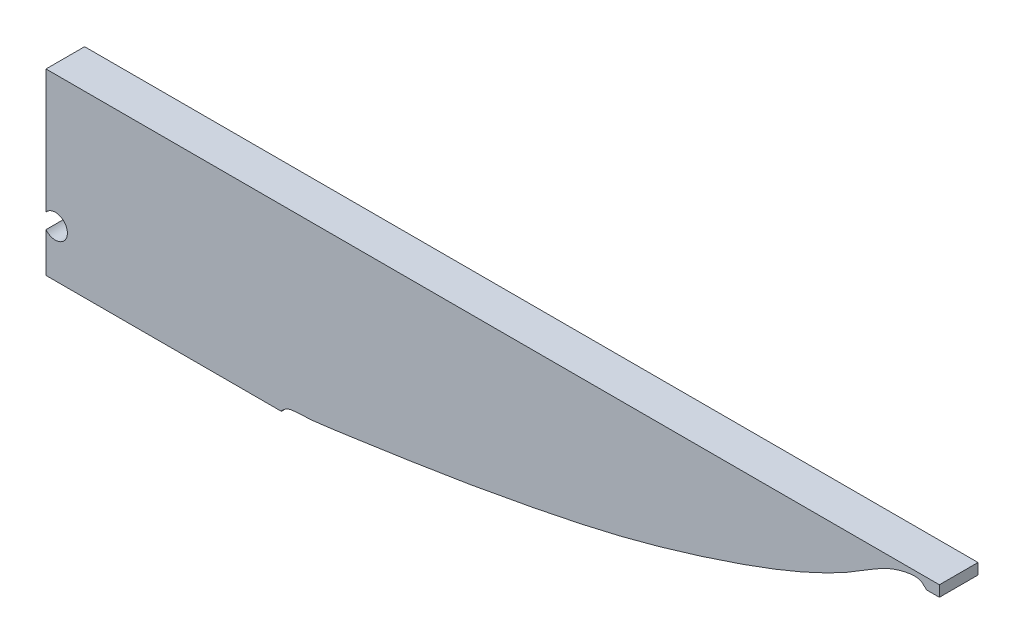
ISO-10303-21;
HEADER;
FILE_DESCRIPTION(('STEP AP214'),'2;1');
FILE_NAME('part.step','',(''),(''),'','','');
FILE_SCHEMA(('AUTOMOTIVE_DESIGN { 1 0 10303 214 1 1 1 1 }'));
ENDSEC;
DATA;
#1=APPLICATION_CONTEXT('core data for automotive mechanical design processes');
#2=APPLICATION_PROTOCOL_DEFINITION('international standard','automotive_design',2000,#1);
#3=PRODUCT_CONTEXT('',#1,'mechanical');
#4=PRODUCT('Part','Part','',(#3));
#5=PRODUCT_RELATED_PRODUCT_CATEGORY('part','',(#4));
#6=PRODUCT_DEFINITION_FORMATION('','',#4);
#7=PRODUCT_DEFINITION_CONTEXT('part definition',#1,'design');
#8=PRODUCT_DEFINITION('design','',#6,#7);
#9=PRODUCT_DEFINITION_SHAPE('','',#8);
#10=(LENGTH_UNIT() NAMED_UNIT(*) SI_UNIT(.MILLI.,.METRE.));
#11=(NAMED_UNIT(*) PLANE_ANGLE_UNIT() SI_UNIT($,.RADIAN.));
#12=(NAMED_UNIT(*) SI_UNIT($,.STERADIAN.) SOLID_ANGLE_UNIT());
#13=UNCERTAINTY_MEASURE_WITH_UNIT(LENGTH_MEASURE(1.E-05),#10,'distance_accuracy_value','');
#14=(GEOMETRIC_REPRESENTATION_CONTEXT(3) GLOBAL_UNCERTAINTY_ASSIGNED_CONTEXT((#13)) GLOBAL_UNIT_ASSIGNED_CONTEXT((#10,
#11,#12)) REPRESENTATION_CONTEXT('',''));
#15=CARTESIAN_POINT('',(0.,0.,0.));
#16=DIRECTION('',(0.,0.,1.));
#17=DIRECTION('',(1.,0.,0.));
#18=AXIS2_PLACEMENT_3D('',#15,#16,#17);
#19=CARTESIAN_POINT('',(-101.938479936782,-34.8132065424627,324.));
#20=DIRECTION('',(1.,0.,0.));
#21=DIRECTION('',(0.,1.,0.));
#22=AXIS2_PLACEMENT_3D('',#19,#20,#21);
#23=PLANE('',#22);
#24=DIRECTION('',(0.,-1.,0.));
#25=VECTOR('',#24,1.);
#26=CARTESIAN_POINT('',(-101.938479936782,-34.8132065424627,316.));
#27=LINE('',#26,#25);
#28=CARTESIAN_POINT('',(-101.938479936782,2.25600000000002,316.));
#29=VERTEX_POINT('',#28);
#30=CARTESIAN_POINT('',(-101.938479936782,-23.4212994157553,316.));
#31=VERTEX_POINT('',#30);
#32=EDGE_CURVE('E249',#29,#31,#27,.T.);
#33=ORIENTED_EDGE('',*,*,#32,.T.);
#34=DIRECTION('',(0.,0.,1.));
#35=VECTOR('',#34,1.);
#36=CARTESIAN_POINT('',(-101.938479936782,-23.4212994157553,308.));
#37=LINE('',#36,#35);
#38=CARTESIAN_POINT('',(-101.938479936782,-23.4212994157553,324.));
#39=VERTEX_POINT('',#38);
#40=EDGE_CURVE('E48',#31,#39,#37,.T.);
#41=ORIENTED_EDGE('',*,*,#40,.T.);
#42=DIRECTION('',(0.,-1.,0.));
#43=VECTOR('',#42,1.);
#44=CARTESIAN_POINT('',(-101.938479936782,-34.8132065424627,324.));
#45=LINE('',#44,#43);
#46=CARTESIAN_POINT('',(-101.938479936782,2.25600000000002,324.));
#47=VERTEX_POINT('',#46);
#48=EDGE_CURVE('E110',#47,#39,#45,.T.);
#49=ORIENTED_EDGE('',*,*,#48,.F.);
#50=DIRECTION('',(0.,0.,-1.));
#51=VECTOR('',#50,1.);
#52=CARTESIAN_POINT('',(-101.938479936782,2.25600000000002,324.));
#53=LINE('',#52,#51);
#54=EDGE_CURVE('E118',#47,#29,#53,.T.);
#55=ORIENTED_EDGE('',*,*,#54,.T.);
#56=EDGE_LOOP('',(#33,#41,#49,#55));
#57=FACE_BOUND('',#56,.T.);
#58=ADVANCED_FACE('F30',(#57),#23,.F.);
#59=CARTESIAN_POINT('',(-53.1549275378333,-34.8091907806009,324.));
#60=CARTESIAN_POINT('',(-53.1298708667686,-34.7201445548623,324.));
#61=CARTESIAN_POINT('',(-53.0789366636254,-34.6422995615166,324.));
#62=CARTESIAN_POINT('',(-52.9577620257177,-34.5051025794421,324.));
#63=CARTESIAN_POINT('',(-52.8899246823672,-34.4440108283981,324.));
#64=CARTESIAN_POINT('',(-52.6828277004742,-34.2644474664142,324.));
#65=CARTESIAN_POINT('',(-52.5430638828932,-34.1462438640899,324.));
#66=CARTESIAN_POINT('',(-52.2472350404539,-33.9350915829857,324.));
#67=CARTESIAN_POINT('',(-52.092019880983,-33.8404166730012,324.));
#68=CARTESIAN_POINT('',(-51.7572426092875,-33.6874209498995,324.));
#69=CARTESIAN_POINT('',(-51.5839717565869,-33.6293652959376,324.));
#70=CARTESIAN_POINT('',(-51.0548344430005,-33.4922042337446,324.));
#71=CARTESIAN_POINT('',(-50.6887400033102,-33.447896332659,324.));
#72=CARTESIAN_POINT('',(-49.9609219867537,-33.38869067422,324.));
#73=CARTESIAN_POINT('',(-49.5959219365605,-33.376606399533,324.));
#74=CARTESIAN_POINT('',(-48.865674265692,-33.3564130200724,324.));
#75=CARTESIAN_POINT('',(-48.5005528247049,-33.3456014629502,324.));
#76=CARTESIAN_POINT('',(-47.771748265183,-33.3072795345679,324.));
#77=CARTESIAN_POINT('',(-47.4078588507021,-33.2822211029365,324.));
#78=CARTESIAN_POINT('',(-46.317616796073,-33.1906459806036,324.));
#79=CARTESIAN_POINT('',(-45.5927094243109,-33.1067704827112,324.));
#80=CARTESIAN_POINT('',(-44.1448865409835,-32.9192556878903,324.));
#81=CARTESIAN_POINT('',(-43.4220109122779,-32.8180340428165,324.));
#82=CARTESIAN_POINT('',(-41.9758965544157,-32.6182073174373,324.));
#83=CARTESIAN_POINT('',(-41.252958421744,-32.5174360867727,324.));
#84=CARTESIAN_POINT('',(-39.0846109921793,-32.2117573392115,324.));
#85=CARTESIAN_POINT('',(-37.6396617723036,-32.0035357794657,324.));
#86=CARTESIAN_POINT('',(-33.3049538379431,-31.3780520832329,324.));
#87=CARTESIAN_POINT('',(-30.4158446665213,-30.9562105112095,324.));
#88=CARTESIAN_POINT('',(-24.6401025014606,-30.0958801875536,324.));
#89=CARTESIAN_POINT('',(-21.7541808939475,-29.6528193090271,324.));
#90=CARTESIAN_POINT('',(-15.9894158874452,-28.7222905479933,324.));
#91=CARTESIAN_POINT('',(-13.1108255517432,-28.2338058152906,324.));
#92=CARTESIAN_POINT('',(-7.36261655694701,-27.209428633291,324.));
#93=CARTESIAN_POINT('',(-4.49259707605948,-26.6748227289964,324.));
#94=CARTESIAN_POINT('',(1.24005807536501,-25.5650908418439,324.));
#95=CARTESIAN_POINT('',(4.10336545393813,-24.9934364793302,324.));
#96=CARTESIAN_POINT('',(9.81588465943968,-23.7886285262029,324.));
#97=CARTESIAN_POINT('',(12.6651295507626,-23.1545048574998,324.));
#98=CARTESIAN_POINT('',(18.34115302415,-21.7846675373089,324.));
#99=CARTESIAN_POINT('',(21.1674651231057,-21.0472729986933,324.));
#100=CARTESIAN_POINT('',(26.7901933578703,-19.4774722148131,324.));
#101=CARTESIAN_POINT('',(29.5880499480561,-18.6459579798337,324.));
#102=CARTESIAN_POINT('',(35.1631796924488,-16.9118970373892,324.));
#103=CARTESIAN_POINT('',(37.9404215095924,-16.0086676868197,324.));
#104=CARTESIAN_POINT('',(43.4646612308998,-14.1163952925042,324.));
#105=CARTESIAN_POINT('',(46.213277565254,-13.1291587617788,324.));
#106=CARTESIAN_POINT('',(50.2968977974003,-11.5480576560877,324.));
#107=CARTESIAN_POINT('',(51.6521252957614,-11.0034212597311,324.));
#108=CARTESIAN_POINT('',(54.3422109967277,-9.87038682235897,324.));
#109=CARTESIAN_POINT('',(55.6759472437144,-9.28172319709407,324.));
#110=CARTESIAN_POINT('',(58.3212740403276,-8.06101885123503,324.));
#111=CARTESIAN_POINT('',(59.6331513600418,-7.42953983132861,324.));
#112=CARTESIAN_POINT('',(62.2276781476394,-6.109332778558,324.));
#113=CARTESIAN_POINT('',(63.5099540056446,-5.41987295066206,324.));
#114=CARTESIAN_POINT('',(65.4000384877134,-4.32040062078005,324.));
#115=CARTESIAN_POINT('',(66.0247194431423,-3.94343619644742,324.));
#116=CARTESIAN_POINT('',(67.2685251327047,-3.17862429736931,324.));
#117=CARTESIAN_POINT('',(67.8867968679098,-2.78905435932817,324.));
#118=CARTESIAN_POINT('',(69.7473260334223,-1.63189882250514,324.));
#119=CARTESIAN_POINT('',(70.9965236676854,-0.878676491304755,324.));
#120=CARTESIAN_POINT('',(72.9770382606335,0.0313865595637071,324.));
#121=CARTESIAN_POINT('',(73.6556666595979,0.296731682483029,324.));
#122=CARTESIAN_POINT('',(75.0507832178697,0.749455274363966,324.));
#123=CARTESIAN_POINT('',(75.7676043796034,0.938695570511541,324.));
#124=CARTESIAN_POINT('',(76.8495518454685,1.14094255861637,324.));
#125=CARTESIAN_POINT('',(77.2122729163409,1.19539414296185,324.));
#126=CARTESIAN_POINT('',(77.7628150940775,1.23664740429515,324.));
#127=CARTESIAN_POINT('',(77.9473635839775,1.24392600760397,324.));
#128=CARTESIAN_POINT('',(78.3189870554186,1.24267483097595,324.));
#129=CARTESIAN_POINT('',(78.504633024259,1.23336108044294,324.));
#130=CARTESIAN_POINT('',(78.8706232698845,1.1834377502822,324.));
#131=CARTESIAN_POINT('',(79.054214120695,1.14135125245161,324.));
#132=CARTESIAN_POINT('',(79.3990381640552,1.00364179747532,324.));
#133=CARTESIAN_POINT('',(79.5554055117071,0.905347272903334,324.));
#134=CARTESIAN_POINT('',(79.8512227913995,0.67771706443728,324.));
#135=CARTESIAN_POINT('',(79.9868284231719,0.550031015610812,324.));
#136=CARTESIAN_POINT('',(80.1960964877878,0.365154334536862,324.));
#137=CARTESIAN_POINT('',(80.2660969464056,0.303800970358101,324.));
#138=CARTESIAN_POINT('',(80.3936641003492,0.167248458555416,324.));
#139=CARTESIAN_POINT('',(80.4481434739488,0.0899135606780191,324.));
#140=CARTESIAN_POINT('',(80.4759889897541,0.,324.));
#141=B_SPLINE_CURVE_WITH_KNOTS('',3,(#59,#60,#61,#62,#63,#64,#65,#66,#67,#68,#69,#70,#71,#72,
#73,#74,#75,#76,#77,#78,#79,#80,#81,#82,#83,#84,#85,#86,#87,#88,#89,#90,#91,#92,#93,#94,#95,#96,
#97,#98,#99,#100,#101,#102,#103,#104,#105,#106,#107,#108,#109,#110,#111,#112,#113,#114,#115,
#116,#117,#118,#119,#120,#121,#122,#123,#124,#125,#126,#127,#128,#129,#130,#131,#132,#133,#134,
#135,#136,#137,#138,#139,#140),.UNSPECIFIED.,.F.,.F.,(4,2,2,2,2,2,2,2,2,2,2,2,2,2,2,2,2,2,2,2,2,
2,2,2,2,2,2,2,2,2,2,2,2,2,2,2,2,2,2,2,4),(0.,0.001953125,0.00390625,0.0078125,
0.0117187499999999,0.0156249999999999,0.0234375,0.03125,0.0390625,0.0468750000000001,
0.0625000000000001,0.0781250000000001,0.0937500000000001,0.125,0.1875,0.25,0.3125,0.375,0.4375,
0.5,0.5625,0.625,0.6875,0.75,0.78125,0.8125,0.84375,0.875,0.890625,0.90625,0.9375,0.953125,
0.96875,0.9765625,0.98046875,0.984375,0.98828125,0.9921875,0.99609375,0.998046875,1.),.UNSPECIFIED.);
#142=DIRECTION('',(0.,0.,-1.));
#143=VECTOR('',#142,1.);
#144=SURFACE_OF_LINEAR_EXTRUSION('',#141,#143);
#145=CARTESIAN_POINT('',(-53.1549275378333,-34.8091907806009,316.));
#146=CARTESIAN_POINT('',(-53.1298708667686,-34.7201445548623,316.));
#147=CARTESIAN_POINT('',(-53.0789366636254,-34.6422995615166,316.));
#148=CARTESIAN_POINT('',(-52.9577620257177,-34.5051025794421,316.));
#149=CARTESIAN_POINT('',(-52.8899246823672,-34.4440108283981,316.));
#150=CARTESIAN_POINT('',(-52.6828277004742,-34.2644474664142,316.));
#151=CARTESIAN_POINT('',(-52.5430638828932,-34.1462438640899,316.));
#152=CARTESIAN_POINT('',(-52.2472350404539,-33.9350915829857,316.));
#153=CARTESIAN_POINT('',(-52.092019880983,-33.8404166730012,316.));
#154=CARTESIAN_POINT('',(-51.7572426092875,-33.6874209498995,316.));
#155=CARTESIAN_POINT('',(-51.5839717565869,-33.6293652959376,316.));
#156=CARTESIAN_POINT('',(-51.0548344430005,-33.4922042337446,316.));
#157=CARTESIAN_POINT('',(-50.6887400033102,-33.447896332659,316.));
#158=CARTESIAN_POINT('',(-49.9609219867537,-33.38869067422,316.));
#159=CARTESIAN_POINT('',(-49.5959219365605,-33.376606399533,316.));
#160=CARTESIAN_POINT('',(-48.865674265692,-33.3564130200724,316.));
#161=CARTESIAN_POINT('',(-48.5005528247049,-33.3456014629502,316.));
#162=CARTESIAN_POINT('',(-47.771748265183,-33.3072795345679,316.));
#163=CARTESIAN_POINT('',(-47.4078588507021,-33.2822211029365,316.));
#164=CARTESIAN_POINT('',(-46.317616796073,-33.1906459806036,316.));
#165=CARTESIAN_POINT('',(-45.5927094243109,-33.1067704827112,316.));
#166=CARTESIAN_POINT('',(-44.1448865409835,-32.9192556878903,316.));
#167=CARTESIAN_POINT('',(-43.4220109122779,-32.8180340428165,316.));
#168=CARTESIAN_POINT('',(-41.9758965544157,-32.6182073174373,316.));
#169=CARTESIAN_POINT('',(-41.252958421744,-32.5174360867727,316.));
#170=CARTESIAN_POINT('',(-39.0846109921793,-32.2117573392115,316.));
#171=CARTESIAN_POINT('',(-37.6396617723036,-32.0035357794657,316.));
#172=CARTESIAN_POINT('',(-33.3049538379431,-31.3780520832329,316.));
#173=CARTESIAN_POINT('',(-30.4158446665213,-30.9562105112095,316.));
#174=CARTESIAN_POINT('',(-24.6401025014606,-30.0958801875536,316.));
#175=CARTESIAN_POINT('',(-21.7541808939475,-29.6528193090271,316.));
#176=CARTESIAN_POINT('',(-15.9894158874452,-28.7222905479933,316.));
#177=CARTESIAN_POINT('',(-13.1108255517432,-28.2338058152906,316.));
#178=CARTESIAN_POINT('',(-7.36261655694701,-27.209428633291,316.));
#179=CARTESIAN_POINT('',(-4.49259707605948,-26.6748227289964,316.));
#180=CARTESIAN_POINT('',(1.24005807536501,-25.5650908418439,316.));
#181=CARTESIAN_POINT('',(4.10336545393813,-24.9934364793302,316.));
#182=CARTESIAN_POINT('',(9.81588465943968,-23.7886285262029,316.));
#183=CARTESIAN_POINT('',(12.6651295507626,-23.1545048574998,316.));
#184=CARTESIAN_POINT('',(18.34115302415,-21.7846675373089,316.));
#185=CARTESIAN_POINT('',(21.1674651231057,-21.0472729986933,316.));
#186=CARTESIAN_POINT('',(26.7901933578703,-19.4774722148131,316.));
#187=CARTESIAN_POINT('',(29.5880499480561,-18.6459579798337,316.));
#188=CARTESIAN_POINT('',(35.1631796924488,-16.9118970373892,316.));
#189=CARTESIAN_POINT('',(37.9404215095924,-16.0086676868197,316.));
#190=CARTESIAN_POINT('',(43.4646612308998,-14.1163952925042,316.));
#191=CARTESIAN_POINT('',(46.213277565254,-13.1291587617788,316.));
#192=CARTESIAN_POINT('',(50.2968977974003,-11.5480576560877,316.));
#193=CARTESIAN_POINT('',(51.6521252957614,-11.0034212597311,316.));
#194=CARTESIAN_POINT('',(54.3422109967277,-9.87038682235897,316.));
#195=CARTESIAN_POINT('',(55.6759472437144,-9.28172319709407,316.));
#196=CARTESIAN_POINT('',(58.3212740403276,-8.06101885123503,316.));
#197=CARTESIAN_POINT('',(59.6331513600418,-7.42953983132861,316.));
#198=CARTESIAN_POINT('',(62.2276781476394,-6.109332778558,316.));
#199=CARTESIAN_POINT('',(63.5099540056446,-5.41987295066206,316.));
#200=CARTESIAN_POINT('',(65.4000384877134,-4.32040062078005,316.));
#201=CARTESIAN_POINT('',(66.0247194431423,-3.94343619644742,316.));
#202=CARTESIAN_POINT('',(67.2685251327047,-3.17862429736931,316.));
#203=CARTESIAN_POINT('',(67.8867968679098,-2.78905435932817,316.));
#204=CARTESIAN_POINT('',(69.7473260334223,-1.63189882250514,316.));
#205=CARTESIAN_POINT('',(70.9965236676854,-0.878676491304755,316.));
#206=CARTESIAN_POINT('',(72.9770382606335,0.0313865595637071,316.));
#207=CARTESIAN_POINT('',(73.6556666595979,0.296731682483029,316.));
#208=CARTESIAN_POINT('',(75.0507832178697,0.749455274363966,316.));
#209=CARTESIAN_POINT('',(75.7676043796034,0.938695570511541,316.));
#210=CARTESIAN_POINT('',(76.8495518454685,1.14094255861637,316.));
#211=CARTESIAN_POINT('',(77.2122729163409,1.19539414296185,316.));
#212=CARTESIAN_POINT('',(77.7628150940775,1.23664740429515,316.));
#213=CARTESIAN_POINT('',(77.9473635839775,1.24392600760397,316.));
#214=CARTESIAN_POINT('',(78.3189870554186,1.24267483097595,316.));
#215=CARTESIAN_POINT('',(78.504633024259,1.23336108044294,316.));
#216=CARTESIAN_POINT('',(78.8706232698845,1.1834377502822,316.));
#217=CARTESIAN_POINT('',(79.054214120695,1.14135125245161,316.));
#218=CARTESIAN_POINT('',(79.3990381640552,1.00364179747532,316.));
#219=CARTESIAN_POINT('',(79.5554055117071,0.905347272903334,316.));
#220=CARTESIAN_POINT('',(79.8512227913995,0.67771706443728,316.));
#221=CARTESIAN_POINT('',(79.9868284231719,0.550031015610812,316.));
#222=CARTESIAN_POINT('',(80.1960964877878,0.365154334536862,316.));
#223=CARTESIAN_POINT('',(80.2660969464056,0.303800970358101,316.));
#224=CARTESIAN_POINT('',(80.3936641003492,0.167248458555416,316.));
#225=CARTESIAN_POINT('',(80.4481434739488,0.0899135606780191,316.));
#226=CARTESIAN_POINT('',(80.4759889897541,0.,316.));
#227=B_SPLINE_CURVE_WITH_KNOTS('',3,(#145,#146,#147,#148,#149,#150,#151,#152,#153,#154,#155,
#156,#157,#158,#159,#160,#161,#162,#163,#164,#165,#166,#167,#168,#169,#170,#171,#172,#173,#174,
#175,#176,#177,#178,#179,#180,#181,#182,#183,#184,#185,#186,#187,#188,#189,#190,#191,#192,#193,
#194,#195,#196,#197,#198,#199,#200,#201,#202,#203,#204,#205,#206,#207,#208,#209,#210,#211,#212,
#213,#214,#215,#216,#217,#218,#219,#220,#221,#222,#223,#224,#225,#226),.UNSPECIFIED.,.F.,.F.,(4,
2,2,2,2,2,2,2,2,2,2,2,2,2,2,2,2,2,2,2,2,2,2,2,2,2,2,2,2,2,2,2,2,2,2,2,2,2,2,2,4),(0.,
0.001953125,0.00390625,0.0078125,0.0117187499999999,0.0156249999999999,0.0234375,0.03125,
0.0390625,0.0468750000000001,0.0625000000000001,0.0781250000000001,0.0937500000000001,0.125,
0.1875,0.25,0.3125,0.375,0.4375,0.5,0.5625,0.625,0.6875,0.75,0.78125,0.8125,0.84375,0.875,
0.890625,0.90625,0.9375,0.953125,0.96875,0.9765625,0.98046875,0.984375,0.98828125,0.9921875,
0.99609375,0.998046875,1.),.UNSPECIFIED.);
#228=CARTESIAN_POINT('',(-53.1549275378332,-34.8091907806009,316.));
#229=VERTEX_POINT('',#228);
#230=CARTESIAN_POINT('',(80.4759889897541,0.,316.));
#231=VERTEX_POINT('',#230);
#232=EDGE_CURVE('E227',#229,#231,#227,.T.);
#233=ORIENTED_EDGE('',*,*,#232,.T.);
#234=DIRECTION('',(0.,0.,-1.));
#235=VECTOR('',#234,1.);
#236=CARTESIAN_POINT('',(80.4759889897541,0.,324.));
#237=LINE('',#236,#235);
#238=CARTESIAN_POINT('',(80.4759889897541,0.,324.));
#239=VERTEX_POINT('',#238);
#240=EDGE_CURVE('E42',#239,#231,#237,.T.);
#241=ORIENTED_EDGE('',*,*,#240,.F.);
#242=CARTESIAN_POINT('',(80.4759889897541,0.,324.));
#243=CARTESIAN_POINT('',(80.4481434739488,0.0899135606780191,324.));
#244=CARTESIAN_POINT('',(80.3936641003492,0.167248458555416,324.));
#245=CARTESIAN_POINT('',(80.2660969464056,0.303800970358101,324.));
#246=CARTESIAN_POINT('',(80.1960964877878,0.365154334536862,324.));
#247=CARTESIAN_POINT('',(79.9868284231719,0.550031015610812,324.));
#248=CARTESIAN_POINT('',(79.8512227913995,0.67771706443728,324.));
#249=CARTESIAN_POINT('',(79.5554055117071,0.905347272903334,324.));
#250=CARTESIAN_POINT('',(79.3990381640552,1.00364179747532,324.));
#251=CARTESIAN_POINT('',(79.054214120695,1.14135125245161,324.));
#252=CARTESIAN_POINT('',(78.8706232698845,1.1834377502822,324.));
#253=CARTESIAN_POINT('',(78.504633024259,1.23336108044294,324.));
#254=CARTESIAN_POINT('',(78.3189870554186,1.24267483097595,324.));
#255=CARTESIAN_POINT('',(77.9473635839775,1.24392600760397,324.));
#256=CARTESIAN_POINT('',(77.7628150940775,1.23664740429515,324.));
#257=CARTESIAN_POINT('',(77.2122729163409,1.19539414296185,324.));
#258=CARTESIAN_POINT('',(76.8495518454685,1.14094255861637,324.));
#259=CARTESIAN_POINT('',(75.7676043796034,0.938695570511541,324.));
#260=CARTESIAN_POINT('',(75.0507832178697,0.749455274363966,324.));
#261=CARTESIAN_POINT('',(73.6556666595979,0.296731682483029,324.));
#262=CARTESIAN_POINT('',(72.9770382606335,0.0313865595637071,324.));
#263=CARTESIAN_POINT('',(70.9965236676854,-0.878676491304755,324.));
#264=CARTESIAN_POINT('',(69.7473260334223,-1.63189882250514,324.));
#265=CARTESIAN_POINT('',(67.8867968679098,-2.78905435932817,324.));
#266=CARTESIAN_POINT('',(67.2685251327047,-3.17862429736931,324.));
#267=CARTESIAN_POINT('',(66.0247194431423,-3.94343619644742,324.));
#268=CARTESIAN_POINT('',(65.4000384877134,-4.32040062078005,324.));
#269=CARTESIAN_POINT('',(63.5099540056446,-5.41987295066206,324.));
#270=CARTESIAN_POINT('',(62.2276781476394,-6.109332778558,324.));
#271=CARTESIAN_POINT('',(59.6331513600418,-7.42953983132861,324.));
#272=CARTESIAN_POINT('',(58.3212740403276,-8.06101885123503,324.));
#273=CARTESIAN_POINT('',(55.6759472437144,-9.28172319709407,324.));
#274=CARTESIAN_POINT('',(54.3422109967277,-9.87038682235897,324.));
#275=CARTESIAN_POINT('',(51.6521252957614,-11.0034212597311,324.));
#276=CARTESIAN_POINT('',(50.2968977974003,-11.5480576560877,324.));
#277=CARTESIAN_POINT('',(46.213277565254,-13.1291587617788,324.));
#278=CARTESIAN_POINT('',(43.4646612308998,-14.1163952925042,324.));
#279=CARTESIAN_POINT('',(37.9404215095924,-16.0086676868197,324.));
#280=CARTESIAN_POINT('',(35.1631796924488,-16.9118970373892,324.));
#281=CARTESIAN_POINT('',(29.5880499480561,-18.6459579798337,324.));
#282=CARTESIAN_POINT('',(26.7901933578703,-19.4774722148131,324.));
#283=CARTESIAN_POINT('',(21.1674651231057,-21.0472729986933,324.));
#284=CARTESIAN_POINT('',(18.34115302415,-21.7846675373089,324.));
#285=CARTESIAN_POINT('',(12.6651295507626,-23.1545048574998,324.));
#286=CARTESIAN_POINT('',(9.81588465943968,-23.7886285262029,324.));
#287=CARTESIAN_POINT('',(4.10336545393813,-24.9934364793302,324.));
#288=CARTESIAN_POINT('',(1.24005807536501,-25.5650908418439,324.));
#289=CARTESIAN_POINT('',(-4.49259707605948,-26.6748227289964,324.));
#290=CARTESIAN_POINT('',(-7.36261655694701,-27.209428633291,324.));
#291=CARTESIAN_POINT('',(-13.1108255517432,-28.2338058152906,324.));
#292=CARTESIAN_POINT('',(-15.9894158874452,-28.7222905479933,324.));
#293=CARTESIAN_POINT('',(-21.7541808939475,-29.6528193090271,324.));
#294=CARTESIAN_POINT('',(-24.6401025014606,-30.0958801875536,324.));
#295=CARTESIAN_POINT('',(-30.4158446665213,-30.9562105112095,324.));
#296=CARTESIAN_POINT('',(-33.3049538379431,-31.3780520832329,324.));
#297=CARTESIAN_POINT('',(-37.6396617723036,-32.0035357794657,324.));
#298=CARTESIAN_POINT('',(-39.0846109921793,-32.2117573392115,324.));
#299=CARTESIAN_POINT('',(-41.252958421744,-32.5174360867727,324.));
#300=CARTESIAN_POINT('',(-41.9758965544157,-32.6182073174373,324.));
#301=CARTESIAN_POINT('',(-43.4220109122779,-32.8180340428165,324.));
#302=CARTESIAN_POINT('',(-44.1448865409835,-32.9192556878903,324.));
#303=CARTESIAN_POINT('',(-45.5927094243109,-33.1067704827112,324.));
#304=CARTESIAN_POINT('',(-46.317616796073,-33.1906459806036,324.));
#305=CARTESIAN_POINT('',(-47.4078588507021,-33.2822211029365,324.));
#306=CARTESIAN_POINT('',(-47.771748265183,-33.3072795345679,324.));
#307=CARTESIAN_POINT('',(-48.5005528247049,-33.3456014629502,324.));
#308=CARTESIAN_POINT('',(-48.865674265692,-33.3564130200724,324.));
#309=CARTESIAN_POINT('',(-49.5959219365605,-33.376606399533,324.));
#310=CARTESIAN_POINT('',(-49.9609219867537,-33.38869067422,324.));
#311=CARTESIAN_POINT('',(-50.6887400033102,-33.447896332659,324.));
#312=CARTESIAN_POINT('',(-51.0548344430005,-33.4922042337446,324.));
#313=CARTESIAN_POINT('',(-51.5839717565869,-33.6293652959376,324.));
#314=CARTESIAN_POINT('',(-51.7572426092875,-33.6874209498995,324.));
#315=CARTESIAN_POINT('',(-52.092019880983,-33.8404166730012,324.));
#316=CARTESIAN_POINT('',(-52.2472350404539,-33.9350915829857,324.));
#317=CARTESIAN_POINT('',(-52.5430638828932,-34.1462438640899,324.));
#318=CARTESIAN_POINT('',(-52.6828277004742,-34.2644474664142,324.));
#319=CARTESIAN_POINT('',(-52.8899246823672,-34.4440108283981,324.));
#320=CARTESIAN_POINT('',(-52.9577620257177,-34.5051025794421,324.));
#321=CARTESIAN_POINT('',(-53.0789366636254,-34.6422995615166,324.));
#322=CARTESIAN_POINT('',(-53.1298708667686,-34.7201445548623,324.));
#323=CARTESIAN_POINT('',(-53.1549275378333,-34.8091907806009,324.));
#324=B_SPLINE_CURVE_WITH_KNOTS('',3,(#242,#243,#244,#245,#246,#247,#248,#249,#250,#251,#252,
#253,#254,#255,#256,#257,#258,#259,#260,#261,#262,#263,#264,#265,#266,#267,#268,#269,#270,#271,
#272,#273,#274,#275,#276,#277,#278,#279,#280,#281,#282,#283,#284,#285,#286,#287,#288,#289,#290,
#291,#292,#293,#294,#295,#296,#297,#298,#299,#300,#301,#302,#303,#304,#305,#306,#307,#308,#309,
#310,#311,#312,#313,#314,#315,#316,#317,#318,#319,#320,#321,#322,#323),.UNSPECIFIED.,.F.,.F.,(4,
2,2,2,2,2,2,2,2,2,2,2,2,2,2,2,2,2,2,2,2,2,2,2,2,2,2,2,2,2,2,2,2,2,2,2,2,2,2,2,4),(0.,
0.001953125,0.00390625,0.0078125,0.0117187499999999,0.0156249999999999,0.0195312499999999,
0.0234374999999998,0.0312499999999998,0.0468749999999997,0.0624999999999996,0.0937499999999996,
0.109375,0.125,0.15625,0.1875,0.21875,0.25,0.3125,0.375,0.4375,0.5,0.5625,0.625,0.6875,0.75,
0.8125,0.875,0.90625,0.921875,0.9375,0.953125,0.9609375,0.96875,0.9765625,0.984375,0.98828125,
0.9921875,0.99609375,0.998046875,1.),.UNSPECIFIED.);
#325=CARTESIAN_POINT('',(-53.1549275378332,-34.8091907806009,324.));
#326=VERTEX_POINT('',#325);
#327=EDGE_CURVE('E209',#326,#239,#324,.F.);
#328=ORIENTED_EDGE('',*,*,#327,.F.);
#329=DIRECTION('',(0.,0.,-1.));
#330=VECTOR('',#329,1.);
#331=CARTESIAN_POINT('',(-53.1549275378332,-34.8091907806009,324.));
#332=LINE('',#331,#330);
#333=EDGE_CURVE('E129',#326,#229,#332,.T.);
#334=ORIENTED_EDGE('',*,*,#333,.T.);
#335=EDGE_LOOP('',(#233,#241,#328,#334));
#336=FACE_BOUND('',#335,.T.);
#337=ADVANCED_FACE('F32',(#336),#144,.F.);
#338=CARTESIAN_POINT('',(80.4759889897541,0.,324.));
#339=DIRECTION('',(0.,1.,0.));
#340=DIRECTION('',(-1.,0.,0.));
#341=AXIS2_PLACEMENT_3D('',#338,#339,#340);
#342=PLANE('',#341);
#343=DIRECTION('',(1.,0.,0.));
#344=VECTOR('',#343,1.);
#345=CARTESIAN_POINT('',(80.4759889897541,0.,316.));
#346=LINE('',#345,#344);
#347=CARTESIAN_POINT('',(83.2228555421549,0.,316.));
#348=VERTEX_POINT('',#347);
#349=EDGE_CURVE('E175',#231,#348,#346,.T.);
#350=ORIENTED_EDGE('',*,*,#349,.T.);
#351=DIRECTION('',(0.,0.,-1.));
#352=VECTOR('',#351,1.);
#353=CARTESIAN_POINT('',(83.2228555421549,0.,324.));
#354=LINE('',#353,#352);
#355=CARTESIAN_POINT('',(83.2228555421549,0.,324.));
#356=VERTEX_POINT('',#355);
#357=EDGE_CURVE('E179',#356,#348,#354,.T.);
#358=ORIENTED_EDGE('',*,*,#357,.F.);
#359=DIRECTION('',(1.,0.,0.));
#360=VECTOR('',#359,1.);
#361=CARTESIAN_POINT('',(80.4759889897541,0.,324.));
#362=LINE('',#361,#360);
#363=EDGE_CURVE('E95',#239,#356,#362,.T.);
#364=ORIENTED_EDGE('',*,*,#363,.F.);
#365=ORIENTED_EDGE('',*,*,#240,.T.);
#366=EDGE_LOOP('',(#350,#358,#364,#365));
#367=FACE_BOUND('',#366,.T.);
#368=ADVANCED_FACE('F260',(#367),#342,.F.);
#369=CARTESIAN_POINT('',(83.2228555421549,2.25600000000004,324.));
#370=DIRECTION('',(-1.,0.,0.));
#371=DIRECTION('',(0.,-1.,0.));
#372=AXIS2_PLACEMENT_3D('',#369,#370,#371);
#373=PLANE('',#372);
#374=DIRECTION('',(0.,1.,0.));
#375=VECTOR('',#374,1.);
#376=CARTESIAN_POINT('',(83.2228555421549,2.25600000000004,316.));
#377=LINE('',#376,#375);
#378=CARTESIAN_POINT('',(83.2228555421549,2.25600000000004,316.));
#379=VERTEX_POINT('',#378);
#380=EDGE_CURVE('E170',#348,#379,#377,.T.);
#381=ORIENTED_EDGE('',*,*,#380,.T.);
#382=DIRECTION('',(0.,0.,-1.));
#383=VECTOR('',#382,1.);
#384=CARTESIAN_POINT('',(83.2228555421549,2.25600000000004,324.));
#385=LINE('',#384,#383);
#386=CARTESIAN_POINT('',(83.2228555421549,2.25600000000004,324.));
#387=VERTEX_POINT('',#386);
#388=EDGE_CURVE('E125',#387,#379,#385,.T.);
#389=ORIENTED_EDGE('',*,*,#388,.F.);
#390=DIRECTION('',(0.,1.,0.));
#391=VECTOR('',#390,1.);
#392=CARTESIAN_POINT('',(83.2228555421549,2.25600000000004,324.));
#393=LINE('',#392,#391);
#394=EDGE_CURVE('E112',#356,#387,#393,.T.);
#395=ORIENTED_EDGE('',*,*,#394,.F.);
#396=ORIENTED_EDGE('',*,*,#357,.T.);
#397=EDGE_LOOP('',(#381,#389,#395,#396));
#398=FACE_BOUND('',#397,.T.);
#399=ADVANCED_FACE('F263',(#398),#373,.F.);
#400=CARTESIAN_POINT('',(83.2228555421549,2.25600000000004,324.));
#401=DIRECTION('',(0.,-1.,0.));
#402=DIRECTION('',(1.,0.,0.));
#403=AXIS2_PLACEMENT_3D('',#400,#401,#402);
#404=PLANE('',#403);
#405=DIRECTION('',(-1.,0.,0.));
#406=VECTOR('',#405,1.);
#407=CARTESIAN_POINT('',(83.2228555421549,2.25600000000004,316.));
#408=LINE('',#407,#406);
#409=EDGE_CURVE('E121',#379,#29,#408,.T.);
#410=ORIENTED_EDGE('',*,*,#409,.T.);
#411=ORIENTED_EDGE('',*,*,#54,.F.);
#412=DIRECTION('',(-1.,0.,0.));
#413=VECTOR('',#412,1.);
#414=CARTESIAN_POINT('',(83.2228555421549,2.25600000000004,324.));
#415=LINE('',#414,#413);
#416=EDGE_CURVE('E105',#387,#47,#415,.T.);
#417=ORIENTED_EDGE('',*,*,#416,.F.);
#418=ORIENTED_EDGE('',*,*,#388,.T.);
#419=EDGE_LOOP('',(#410,#411,#417,#418));
#420=FACE_BOUND('',#419,.T.);
#421=ADVANCED_FACE('F119',(#420),#404,.F.);
#422=CARTESIAN_POINT('',(-101.938479936782,-26.5787005842447,324.));
#423=VERTEX_POINT('',#422);
#424=CARTESIAN_POINT('',(-101.938479936782,-34.8132065424627,324.));
#425=VERTEX_POINT('',#424);
#426=EDGE_CURVE('E36',#423,#425,#45,.T.);
#427=ORIENTED_EDGE('',*,*,#426,.F.);
#428=DIRECTION('',(0.,0.,1.));
#429=VECTOR('',#428,1.);
#430=CARTESIAN_POINT('',(-101.938479936782,-26.5787005842447,308.));
#431=LINE('',#430,#429);
#432=CARTESIAN_POINT('',(-101.938479936782,-26.5787005842447,316.));
#433=VERTEX_POINT('',#432);
#434=EDGE_CURVE('E269',#423,#433,#431,.F.);
#435=ORIENTED_EDGE('',*,*,#434,.T.);
#436=CARTESIAN_POINT('',(-101.938479936782,-34.8132065424627,316.));
#437=VERTEX_POINT('',#436);
#438=EDGE_CURVE('E176',#433,#437,#27,.T.);
#439=ORIENTED_EDGE('',*,*,#438,.T.);
#440=DIRECTION('',(0.,0.,-1.));
#441=VECTOR('',#440,1.);
#442=CARTESIAN_POINT('',(-101.938479936782,-34.8132065424627,324.));
#443=LINE('',#442,#441);
#444=EDGE_CURVE('E126',#425,#437,#443,.T.);
#445=ORIENTED_EDGE('',*,*,#444,.F.);
#446=EDGE_LOOP('',(#427,#435,#439,#445));
#447=FACE_BOUND('',#446,.T.);
#448=ADVANCED_FACE('F159',(#447),#23,.F.);
#449=CARTESIAN_POINT('',(-101.938479936782,-34.8132065424627,324.));
#450=CARTESIAN_POINT('',(-85.6772957647792,-34.8124834921942,324.));
#451=CARTESIAN_POINT('',(-69.4161116125254,-34.8111110841553,324.));
#452=CARTESIAN_POINT('',(-53.1549275378332,-34.8091907806009,324.));
#453=B_SPLINE_CURVE_WITH_KNOTS('',3,(#449,#450,#451,#452),.UNSPECIFIED.,.F.,.F.,(4,4),(0.,1.),.UNSPECIFIED.);
#454=DIRECTION('',(0.,0.,-1.));
#455=VECTOR('',#454,1.);
#456=SURFACE_OF_LINEAR_EXTRUSION('',#453,#455);
#457=CARTESIAN_POINT('',(-101.938479936782,-34.8132065424627,316.));
#458=CARTESIAN_POINT('',(-85.6772957647792,-34.8124834921942,316.));
#459=CARTESIAN_POINT('',(-69.4161116125254,-34.8111110841553,316.));
#460=CARTESIAN_POINT('',(-53.1549275378332,-34.8091907806009,316.));
#461=B_SPLINE_CURVE_WITH_KNOTS('',3,(#457,#458,#459,#460),.UNSPECIFIED.,.F.,.F.,(4,4),(0.,1.),.UNSPECIFIED.);
#462=EDGE_CURVE('E85',#437,#229,#461,.T.);
#463=ORIENTED_EDGE('',*,*,#462,.T.);
#464=ORIENTED_EDGE('',*,*,#333,.F.);
#465=CARTESIAN_POINT('',(-53.1549275378332,-34.8091907806009,324.));
#466=CARTESIAN_POINT('',(-69.4161116125254,-34.8111110841553,324.));
#467=CARTESIAN_POINT('',(-85.6772957647792,-34.8124834921942,324.));
#468=CARTESIAN_POINT('',(-101.938479936782,-34.8132065424627,324.));
#469=B_SPLINE_CURVE_WITH_KNOTS('',3,(#465,#466,#467,#468),.UNSPECIFIED.,.F.,.F.,(4,4),(0.,1.),.UNSPECIFIED.);
#470=EDGE_CURVE('E57',#425,#326,#469,.F.);
#471=ORIENTED_EDGE('',*,*,#470,.F.);
#472=ORIENTED_EDGE('',*,*,#444,.T.);
#473=EDGE_LOOP('',(#463,#464,#471,#472));
#474=FACE_BOUND('',#473,.T.);
#475=ADVANCED_FACE('F148',(#474),#456,.F.);
#476=CARTESIAN_POINT('',(15.5031412874563,-22.4695861974044,324.));
#477=DIRECTION('',(0.,0.,-1.));
#478=DIRECTION('',(-1.,0.,0.));
#479=AXIS2_PLACEMENT_3D('',#476,#477,#478);
#480=PLANE('',#479);
#481=ORIENTED_EDGE('',*,*,#48,.T.);
#482=CARTESIAN_POINT('',(-100.,-25.,324.));
#483=DIRECTION('',(0.,0.,-1.));
#484=DIRECTION('',(-1.,0.,0.));
#485=AXIS2_PLACEMENT_3D('',#482,#483,#484);
#486=CIRCLE('',#485,2.5);
#487=EDGE_CURVE('E275',#39,#423,#486,.T.);
#488=ORIENTED_EDGE('',*,*,#487,.T.);
#489=ORIENTED_EDGE('',*,*,#426,.T.);
#490=ORIENTED_EDGE('',*,*,#470,.T.);
#491=ORIENTED_EDGE('',*,*,#327,.T.);
#492=ORIENTED_EDGE('',*,*,#363,.T.);
#493=ORIENTED_EDGE('',*,*,#394,.T.);
#494=ORIENTED_EDGE('',*,*,#416,.T.);
#495=EDGE_LOOP('',(#481,#488,#489,#490,#491,#492,#493,#494));
#496=FACE_BOUND('',#495,.T.);
#497=ADVANCED_FACE('F107',(#496),#480,.F.);
#498=CARTESIAN_POINT('',(15.5031412874563,-22.4695861974044,316.));
#499=DIRECTION('',(0.,0.,-1.));
#500=DIRECTION('',(-1.,0.,0.));
#501=AXIS2_PLACEMENT_3D('',#498,#499,#500);
#502=PLANE('',#501);
#503=CARTESIAN_POINT('',(-100.,-25.,316.));
#504=DIRECTION('',(0.,0.,-1.));
#505=DIRECTION('',(-1.,0.,0.));
#506=AXIS2_PLACEMENT_3D('',#503,#504,#505);
#507=CIRCLE('',#506,2.5);
#508=EDGE_CURVE('E11',#31,#433,#507,.T.);
#509=ORIENTED_EDGE('',*,*,#508,.F.);
#510=ORIENTED_EDGE('',*,*,#32,.F.);
#511=ORIENTED_EDGE('',*,*,#409,.F.);
#512=ORIENTED_EDGE('',*,*,#380,.F.);
#513=ORIENTED_EDGE('',*,*,#349,.F.);
#514=ORIENTED_EDGE('',*,*,#232,.F.);
#515=ORIENTED_EDGE('',*,*,#462,.F.);
#516=ORIENTED_EDGE('',*,*,#438,.F.);
#517=EDGE_LOOP('',(#509,#510,#511,#512,#513,#514,#515,#516));
#518=FACE_BOUND('',#517,.T.);
#519=ADVANCED_FACE('F160',(#518),#502,.T.);
#520=CARTESIAN_POINT('',(-100.,-25.,308.));
#521=DIRECTION('',(0.,0.,1.));
#522=DIRECTION('',(1.,0.,0.));
#523=AXIS2_PLACEMENT_3D('',#520,#521,#522);
#524=CYLINDRICAL_SURFACE('',#523,2.5);
#525=ORIENTED_EDGE('',*,*,#40,.F.);
#526=ORIENTED_EDGE('',*,*,#508,.T.);
#527=ORIENTED_EDGE('',*,*,#434,.F.);
#528=ORIENTED_EDGE('',*,*,#487,.F.);
#529=EDGE_LOOP('',(#525,#526,#527,#528));
#530=FACE_BOUND('',#529,.T.);
#531=ADVANCED_FACE('F192',(#530),#524,.F.);
#532=CLOSED_SHELL('',(#58,#337,#368,#399,#421,#448,#475,#497,#519,#531));
#533=MANIFOLD_SOLID_BREP('B2',#532);
#534=ADVANCED_BREP_SHAPE_REPRESENTATION('',(#18,#533),#14);
#535=SHAPE_DEFINITION_REPRESENTATION(#9,#534);
ENDSEC;
END-ISO-10303-21;
